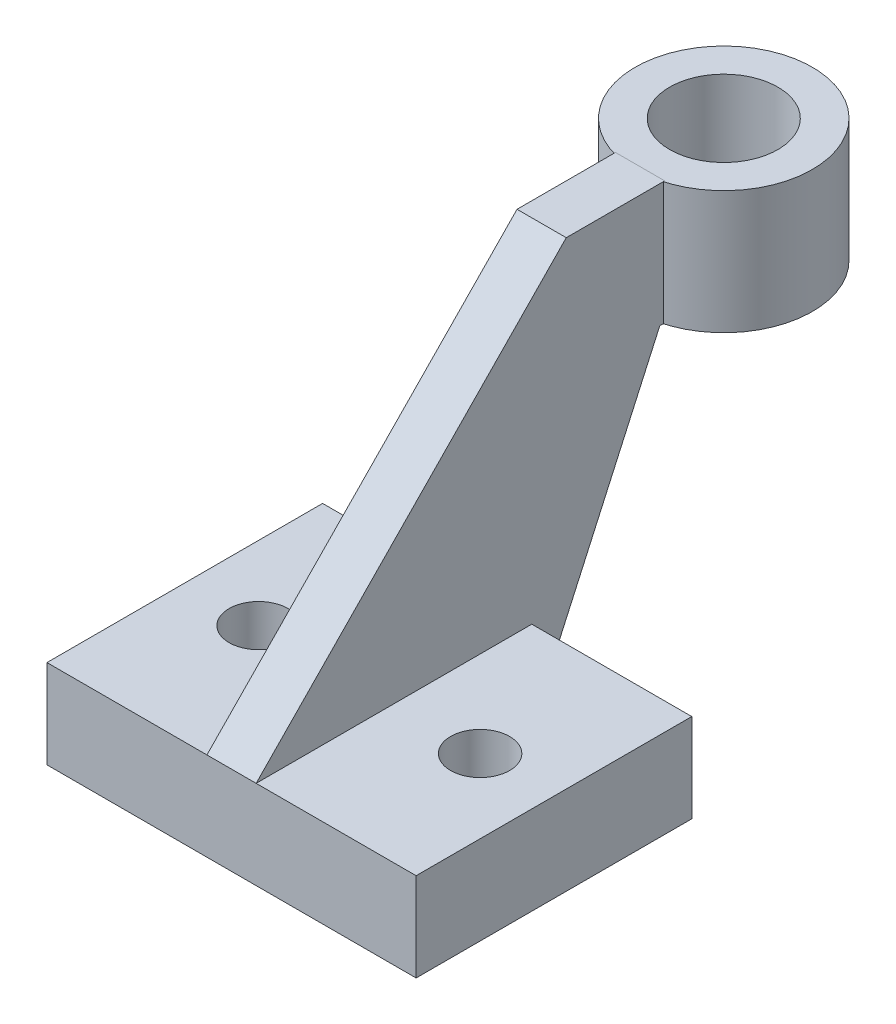
ISO-10303-21;
HEADER;
FILE_DESCRIPTION(('STEP AP214'),'2;1');
FILE_NAME('part.step','',(''),(''),'','','');
FILE_SCHEMA(('AUTOMOTIVE_DESIGN { 1 0 10303 214 1 1 1 1 }'));
ENDSEC;
DATA;
#1=APPLICATION_CONTEXT('core data for automotive mechanical design processes');
#2=APPLICATION_PROTOCOL_DEFINITION('international standard','automotive_design',2000,#1);
#3=PRODUCT_CONTEXT('',#1,'mechanical');
#4=PRODUCT('Part','Part','',(#3));
#5=PRODUCT_RELATED_PRODUCT_CATEGORY('part','',(#4));
#6=PRODUCT_DEFINITION_FORMATION('','',#4);
#7=PRODUCT_DEFINITION_CONTEXT('part definition',#1,'design');
#8=PRODUCT_DEFINITION('design','',#6,#7);
#9=PRODUCT_DEFINITION_SHAPE('','',#8);
#10=(LENGTH_UNIT() NAMED_UNIT(*) SI_UNIT(.MILLI.,.METRE.));
#11=(NAMED_UNIT(*) PLANE_ANGLE_UNIT() SI_UNIT($,.RADIAN.));
#12=(NAMED_UNIT(*) SI_UNIT($,.STERADIAN.) SOLID_ANGLE_UNIT());
#13=UNCERTAINTY_MEASURE_WITH_UNIT(LENGTH_MEASURE(1.E-05),#10,'distance_accuracy_value','');
#14=(GEOMETRIC_REPRESENTATION_CONTEXT(3) GLOBAL_UNCERTAINTY_ASSIGNED_CONTEXT((#13)) GLOBAL_UNIT_ASSIGNED_CONTEXT((#10,
#11,#12)) REPRESENTATION_CONTEXT('',''));
#15=CARTESIAN_POINT('',(0.,0.,0.));
#16=DIRECTION('',(0.,0.,1.));
#17=DIRECTION('',(1.,0.,0.));
#18=AXIS2_PLACEMENT_3D('',#15,#16,#17);
#19=CARTESIAN_POINT('',(0.,82.5,-72.));
#20=DIRECTION('',(0.,1.,0.));
#21=DIRECTION('',(0.,0.,1.));
#22=AXIS2_PLACEMENT_3D('',#19,#20,#21);
#23=PLANE('',#22);
#24=CARTESIAN_POINT('',(0.,82.5,-72.));
#25=DIRECTION('',(0.,1.,0.));
#26=DIRECTION('',(0.,0.,1.));
#27=AXIS2_PLACEMENT_3D('',#24,#25,#26);
#28=CIRCLE('',#27,18.);
#29=CARTESIAN_POINT('',(0.,82.5,-54.));
#30=VERTEX_POINT('',#29);
#31=EDGE_CURVE('E11',#30,#30,#28,.T.);
#32=ORIENTED_EDGE('',*,*,#31,.T.);
#33=EDGE_LOOP('',(#32));
#34=FACE_BOUND('',#33,.T.);
#35=CARTESIAN_POINT('',(0.,82.5,-72.));
#36=DIRECTION('',(0.,1.,0.));
#37=DIRECTION('',(0.,0.,1.));
#38=AXIS2_PLACEMENT_3D('',#35,#36,#37);
#39=CIRCLE('',#38,11.);
#40=CARTESIAN_POINT('',(0.,82.5,-61.));
#41=VERTEX_POINT('',#40);
#42=EDGE_CURVE('E64',#41,#41,#39,.T.);
#43=ORIENTED_EDGE('',*,*,#42,.F.);
#44=EDGE_LOOP('',(#43));
#45=FACE_BOUND('',#44,.T.);
#46=ADVANCED_FACE('F53',(#34,#45),#23,.T.);
#47=CARTESIAN_POINT('',(0.,57.5,-72.));
#48=DIRECTION('',(0.,1.,0.));
#49=DIRECTION('',(0.,0.,1.));
#50=AXIS2_PLACEMENT_3D('',#47,#48,#49);
#51=PLANE('',#50);
#52=CARTESIAN_POINT('',(0.,57.5,-72.));
#53=DIRECTION('',(0.,1.,0.));
#54=DIRECTION('',(0.,0.,1.));
#55=AXIS2_PLACEMENT_3D('',#52,#53,#54);
#56=CIRCLE('',#55,18.);
#57=CARTESIAN_POINT('',(0.,57.5,-54.));
#58=VERTEX_POINT('',#57);
#59=EDGE_CURVE('E57',#58,#58,#56,.T.);
#60=ORIENTED_EDGE('',*,*,#59,.F.);
#61=EDGE_LOOP('',(#60));
#62=FACE_BOUND('',#61,.T.);
#63=CARTESIAN_POINT('',(0.,57.5,-72.));
#64=DIRECTION('',(0.,1.,0.));
#65=DIRECTION('',(0.,0.,1.));
#66=AXIS2_PLACEMENT_3D('',#63,#64,#65);
#67=CIRCLE('',#66,11.);
#68=CARTESIAN_POINT('',(0.,57.5,-61.));
#69=VERTEX_POINT('',#68);
#70=EDGE_CURVE('E66',#69,#69,#67,.T.);
#71=ORIENTED_EDGE('',*,*,#70,.T.);
#72=EDGE_LOOP('',(#71));
#73=FACE_BOUND('',#72,.T.);
#74=ADVANCED_FACE('F76',(#62,#73),#51,.F.);
#75=CARTESIAN_POINT('',(0.,82.5,-72.));
#76=DIRECTION('',(0.,-1.,0.));
#77=DIRECTION('',(0.,0.,-1.));
#78=AXIS2_PLACEMENT_3D('',#75,#76,#77);
#79=CYLINDRICAL_SURFACE('',#78,18.);
#80=ORIENTED_EDGE('',*,*,#31,.F.);
#81=EDGE_LOOP('',(#80));
#82=FACE_BOUND('',#81,.T.);
#83=ORIENTED_EDGE('',*,*,#59,.T.);
#84=EDGE_LOOP('',(#83));
#85=FACE_BOUND('',#84,.T.);
#86=ADVANCED_FACE('F55',(#82,#85),#79,.T.);
#87=CARTESIAN_POINT('',(0.,82.5,-72.));
#88=DIRECTION('',(0.,-1.,0.));
#89=DIRECTION('',(0.,0.,-1.));
#90=AXIS2_PLACEMENT_3D('',#87,#88,#89);
#91=CYLINDRICAL_SURFACE('',#90,11.);
#92=ORIENTED_EDGE('',*,*,#42,.T.);
#93=EDGE_LOOP('',(#92));
#94=FACE_BOUND('',#93,.T.);
#95=ORIENTED_EDGE('',*,*,#70,.F.);
#96=EDGE_LOOP('',(#95));
#97=FACE_BOUND('',#96,.T.);
#98=ADVANCED_FACE('F72',(#94,#97),#91,.F.);
#99=CLOSED_SHELL('',(#46,#74,#86,#98));
#100=MANIFOLD_SOLID_BREP('B2',#99);
#101=CARTESIAN_POINT('',(37.5,18.,28.));
#102=DIRECTION('',(0.,-1.,0.));
#103=DIRECTION('',(0.,0.,-1.));
#104=AXIS2_PLACEMENT_3D('',#101,#102,#103);
#105=PLANE('',#104);
#106=DIRECTION('',(-1.,0.,0.));
#107=VECTOR('',#106,1.);
#108=CARTESIAN_POINT('',(37.5,18.,-28.));
#109=LINE('',#108,#107);
#110=CARTESIAN_POINT('',(37.5,18.,-28.));
#111=VERTEX_POINT('',#110);
#112=CARTESIAN_POINT('',(5.,18.,-28.));
#113=VERTEX_POINT('',#112);
#114=EDGE_CURVE('E311',#111,#113,#109,.T.);
#115=ORIENTED_EDGE('',*,*,#114,.T.);
#116=DIRECTION('',(0.,0.,-1.));
#117=VECTOR('',#116,1.);
#118=CARTESIAN_POINT('',(5.,18.,-28.));
#119=LINE('',#118,#117);
#120=CARTESIAN_POINT('',(5.,18.,28.));
#121=VERTEX_POINT('',#120);
#122=EDGE_CURVE('E261',#121,#113,#119,.T.);
#123=ORIENTED_EDGE('',*,*,#122,.F.);
#124=DIRECTION('',(-1.,0.,0.));
#125=VECTOR('',#124,1.);
#126=CARTESIAN_POINT('',(37.5,18.,28.));
#127=LINE('',#126,#125);
#128=CARTESIAN_POINT('',(37.5,18.,28.));
#129=VERTEX_POINT('',#128);
#130=EDGE_CURVE('E306',#129,#121,#127,.T.);
#131=ORIENTED_EDGE('',*,*,#130,.F.);
#132=DIRECTION('',(0.,0.,1.));
#133=VECTOR('',#132,1.);
#134=CARTESIAN_POINT('',(37.5,18.,28.));
#135=LINE('',#134,#133);
#136=EDGE_CURVE('E288',#111,#129,#135,.T.);
#137=ORIENTED_EDGE('',*,*,#136,.F.);
#138=EDGE_LOOP('',(#115,#123,#131,#137));
#139=FACE_BOUND('',#138,.T.);
#140=CARTESIAN_POINT('',(22.5,18.,0.));
#141=DIRECTION('',(0.,1.,0.));
#142=DIRECTION('',(0.,0.,1.));
#143=AXIS2_PLACEMENT_3D('',#140,#141,#142);
#144=CIRCLE('',#143,6.00000000000001);
#145=CARTESIAN_POINT('',(22.5,18.,6.00000000000001));
#146=VERTEX_POINT('',#145);
#147=EDGE_CURVE('E478',#146,#146,#144,.T.);
#148=ORIENTED_EDGE('',*,*,#147,.F.);
#149=EDGE_LOOP('',(#148));
#150=FACE_BOUND('',#149,.T.);
#151=ADVANCED_FACE('F115',(#139,#150),#105,.F.);
#152=DIRECTION('',(0.,0.,-1.));
#153=VECTOR('',#152,1.);
#154=CARTESIAN_POINT('',(-5.,18.,-28.));
#155=LINE('',#154,#153);
#156=CARTESIAN_POINT('',(-5.,18.,28.));
#157=VERTEX_POINT('',#156);
#158=CARTESIAN_POINT('',(-5.,18.,-28.));
#159=VERTEX_POINT('',#158);
#160=EDGE_CURVE('E240',#157,#159,#155,.T.);
#161=ORIENTED_EDGE('',*,*,#160,.T.);
#162=CARTESIAN_POINT('',(-37.5,18.,-28.));
#163=VERTEX_POINT('',#162);
#164=EDGE_CURVE('E310',#159,#163,#109,.T.);
#165=ORIENTED_EDGE('',*,*,#164,.T.);
#166=DIRECTION('',(0.,0.,1.));
#167=VECTOR('',#166,1.);
#168=CARTESIAN_POINT('',(-37.5,18.,28.));
#169=LINE('',#168,#167);
#170=CARTESIAN_POINT('',(-37.5,18.,28.));
#171=VERTEX_POINT('',#170);
#172=EDGE_CURVE('E282',#163,#171,#169,.T.);
#173=ORIENTED_EDGE('',*,*,#172,.T.);
#174=EDGE_CURVE('E291',#157,#171,#127,.T.);
#175=ORIENTED_EDGE('',*,*,#174,.F.);
#176=EDGE_LOOP('',(#161,#165,#173,#175));
#177=FACE_BOUND('',#176,.T.);
#178=CARTESIAN_POINT('',(-22.5,18.,0.));
#179=DIRECTION('',(0.,1.,0.));
#180=DIRECTION('',(0.,0.,1.));
#181=AXIS2_PLACEMENT_3D('',#178,#179,#180);
#182=CIRCLE('',#181,6.00000000000001);
#183=CARTESIAN_POINT('',(-22.5,18.,6.00000000000001));
#184=VERTEX_POINT('',#183);
#185=EDGE_CURVE('E389',#184,#184,#182,.T.);
#186=ORIENTED_EDGE('',*,*,#185,.F.);
#187=EDGE_LOOP('',(#186));
#188=FACE_BOUND('',#187,.T.);
#189=ADVANCED_FACE('F329',(#177,#188),#105,.F.);
#190=CARTESIAN_POINT('',(37.5,18.,-28.));
#191=DIRECTION('',(0.,0.,1.));
#192=DIRECTION('',(0.,-1.,0.));
#193=AXIS2_PLACEMENT_3D('',#190,#191,#192);
#194=PLANE('',#193);
#195=DIRECTION('',(0.,-1.,0.));
#196=VECTOR('',#195,1.);
#197=CARTESIAN_POINT('',(-5.,0.,-28.));
#198=LINE('',#197,#196);
#199=CARTESIAN_POINT('',(-5.,0.,-28.));
#200=VERTEX_POINT('',#199);
#201=EDGE_CURVE('E131',#159,#200,#198,.T.);
#202=ORIENTED_EDGE('',*,*,#201,.T.);
#203=DIRECTION('',(-1.,0.,0.));
#204=VECTOR('',#203,1.);
#205=CARTESIAN_POINT('',(37.5,0.,-28.));
#206=LINE('',#205,#204);
#207=CARTESIAN_POINT('',(-37.5,0.,-28.));
#208=VERTEX_POINT('',#207);
#209=EDGE_CURVE('E314',#200,#208,#206,.T.);
#210=ORIENTED_EDGE('',*,*,#209,.T.);
#211=DIRECTION('',(0.,1.,0.));
#212=VECTOR('',#211,1.);
#213=CARTESIAN_POINT('',(-37.5,18.,-28.));
#214=LINE('',#213,#212);
#215=EDGE_CURVE('E299',#208,#163,#214,.T.);
#216=ORIENTED_EDGE('',*,*,#215,.T.);
#217=ORIENTED_EDGE('',*,*,#164,.F.);
#218=EDGE_LOOP('',(#202,#210,#216,#217));
#219=FACE_BOUND('',#218,.T.);
#220=ADVANCED_FACE('F319',(#219),#194,.F.);
#221=CARTESIAN_POINT('',(37.5,18.,28.));
#222=DIRECTION('',(0.,0.,-1.));
#223=DIRECTION('',(0.,1.,0.));
#224=AXIS2_PLACEMENT_3D('',#221,#222,#223);
#225=PLANE('',#224);
#226=DIRECTION('',(0.,-1.,0.));
#227=VECTOR('',#226,1.);
#228=CARTESIAN_POINT('',(-37.5,18.,28.));
#229=LINE('',#228,#227);
#230=CARTESIAN_POINT('',(-37.5,0.,28.));
#231=VERTEX_POINT('',#230);
#232=EDGE_CURVE('E276',#171,#231,#229,.T.);
#233=ORIENTED_EDGE('',*,*,#232,.T.);
#234=DIRECTION('',(-1.,0.,0.));
#235=VECTOR('',#234,1.);
#236=CARTESIAN_POINT('',(37.5,0.,28.));
#237=LINE('',#236,#235);
#238=CARTESIAN_POINT('',(37.5,0.,28.));
#239=VERTEX_POINT('',#238);
#240=EDGE_CURVE('E51',#239,#231,#237,.T.);
#241=ORIENTED_EDGE('',*,*,#240,.F.);
#242=DIRECTION('',(0.,-1.,0.));
#243=VECTOR('',#242,1.);
#244=CARTESIAN_POINT('',(37.5,18.,28.));
#245=LINE('',#244,#243);
#246=EDGE_CURVE('E277',#129,#239,#245,.T.);
#247=ORIENTED_EDGE('',*,*,#246,.F.);
#248=ORIENTED_EDGE('',*,*,#130,.T.);
#249=DIRECTION('',(-1.,0.,0.));
#250=VECTOR('',#249,1.);
#251=CARTESIAN_POINT('',(5.,18.,28.));
#252=LINE('',#251,#250);
#253=EDGE_CURVE('E239',#121,#157,#252,.T.);
#254=ORIENTED_EDGE('',*,*,#253,.T.);
#255=ORIENTED_EDGE('',*,*,#174,.T.);
#256=EDGE_LOOP('',(#233,#241,#247,#248,#254,#255));
#257=FACE_BOUND('',#256,.T.);
#258=ADVANCED_FACE('F117',(#257),#225,.F.);
#259=CARTESIAN_POINT('',(37.5,0.,28.));
#260=DIRECTION('',(0.,1.,0.));
#261=DIRECTION('',(0.,0.,1.));
#262=AXIS2_PLACEMENT_3D('',#259,#260,#261);
#263=PLANE('',#262);
#264=CARTESIAN_POINT('',(22.5,0.,0.));
#265=DIRECTION('',(0.,1.,0.));
#266=DIRECTION('',(0.,0.,1.));
#267=AXIS2_PLACEMENT_3D('',#264,#265,#266);
#268=CIRCLE('',#267,6.00000000000001);
#269=CARTESIAN_POINT('',(22.5,0.,6.00000000000001));
#270=VERTEX_POINT('',#269);
#271=EDGE_CURVE('E384',#270,#270,#268,.T.);
#272=ORIENTED_EDGE('',*,*,#271,.T.);
#273=EDGE_LOOP('',(#272));
#274=FACE_BOUND('',#273,.T.);
#275=CARTESIAN_POINT('',(-22.5,0.,0.));
#276=DIRECTION('',(0.,1.,0.));
#277=DIRECTION('',(0.,0.,1.));
#278=AXIS2_PLACEMENT_3D('',#275,#276,#277);
#279=CIRCLE('',#278,6.00000000000001);
#280=CARTESIAN_POINT('',(-22.5,0.,6.00000000000001));
#281=VERTEX_POINT('',#280);
#282=EDGE_CURVE('E243',#281,#281,#279,.T.);
#283=ORIENTED_EDGE('',*,*,#282,.T.);
#284=EDGE_LOOP('',(#283));
#285=FACE_BOUND('',#284,.T.);
#286=DIRECTION('',(0.,0.,-1.));
#287=VECTOR('',#286,1.);
#288=CARTESIAN_POINT('',(-37.5,0.,28.));
#289=LINE('',#288,#287);
#290=EDGE_CURVE('E295',#231,#208,#289,.T.);
#291=ORIENTED_EDGE('',*,*,#290,.T.);
#292=ORIENTED_EDGE('',*,*,#209,.F.);
#293=DIRECTION('',(-1.,0.,0.));
#294=VECTOR('',#293,1.);
#295=CARTESIAN_POINT('',(5.,0.,-28.));
#296=LINE('',#295,#294);
#297=CARTESIAN_POINT('',(5.,0.,-28.));
#298=VERTEX_POINT('',#297);
#299=EDGE_CURVE('E138',#298,#200,#296,.T.);
#300=ORIENTED_EDGE('',*,*,#299,.F.);
#301=CARTESIAN_POINT('',(37.5,0.,-28.));
#302=VERTEX_POINT('',#301);
#303=EDGE_CURVE('E124',#302,#298,#206,.T.);
#304=ORIENTED_EDGE('',*,*,#303,.F.);
#305=DIRECTION('',(0.,0.,-1.));
#306=VECTOR('',#305,1.);
#307=CARTESIAN_POINT('',(37.5,0.,28.));
#308=LINE('',#307,#306);
#309=EDGE_CURVE('E281',#239,#302,#308,.T.);
#310=ORIENTED_EDGE('',*,*,#309,.F.);
#311=ORIENTED_EDGE('',*,*,#240,.T.);
#312=EDGE_LOOP('',(#291,#292,#300,#304,#310,#311));
#313=FACE_BOUND('',#312,.T.);
#314=ADVANCED_FACE('F322',(#274,#285,#313),#263,.F.);
#315=ORIENTED_EDGE('',*,*,#303,.T.);
#316=DIRECTION('',(0.,-1.,0.));
#317=VECTOR('',#316,1.);
#318=CARTESIAN_POINT('',(5.,0.,-28.));
#319=LINE('',#318,#317);
#320=EDGE_CURVE('E208',#113,#298,#319,.T.);
#321=ORIENTED_EDGE('',*,*,#320,.F.);
#322=ORIENTED_EDGE('',*,*,#114,.F.);
#323=DIRECTION('',(0.,1.,0.));
#324=VECTOR('',#323,1.);
#325=CARTESIAN_POINT('',(37.5,18.,-28.));
#326=LINE('',#325,#324);
#327=EDGE_CURVE('E285',#302,#111,#326,.T.);
#328=ORIENTED_EDGE('',*,*,#327,.F.);
#329=EDGE_LOOP('',(#315,#321,#322,#328));
#330=FACE_BOUND('',#329,.T.);
#331=ADVANCED_FACE('F373',(#330),#194,.F.);
#332=CARTESIAN_POINT('',(37.5,0.,0.));
#333=DIRECTION('',(1.,0.,0.));
#334=DIRECTION('',(0.,0.,-1.));
#335=AXIS2_PLACEMENT_3D('',#332,#333,#334);
#336=PLANE('',#335);
#337=ORIENTED_EDGE('',*,*,#246,.T.);
#338=ORIENTED_EDGE('',*,*,#309,.T.);
#339=ORIENTED_EDGE('',*,*,#327,.T.);
#340=ORIENTED_EDGE('',*,*,#136,.T.);
#341=EDGE_LOOP('',(#337,#338,#339,#340));
#342=FACE_BOUND('',#341,.T.);
#343=ADVANCED_FACE('F375',(#342),#336,.T.);
#344=CARTESIAN_POINT('',(-37.5,0.,0.));
#345=DIRECTION('',(1.,0.,0.));
#346=DIRECTION('',(0.,0.,-1.));
#347=AXIS2_PLACEMENT_3D('',#344,#345,#346);
#348=PLANE('',#347);
#349=ORIENTED_EDGE('',*,*,#232,.F.);
#350=ORIENTED_EDGE('',*,*,#172,.F.);
#351=ORIENTED_EDGE('',*,*,#215,.F.);
#352=ORIENTED_EDGE('',*,*,#290,.F.);
#353=EDGE_LOOP('',(#349,#350,#351,#352));
#354=FACE_BOUND('',#353,.T.);
#355=ADVANCED_FACE('F326',(#354),#348,.F.);
#356=CARTESIAN_POINT('',(5.,57.5,-54.));
#357=DIRECTION('',(0.,0.412011262201414,0.911178752945435));
#358=DIRECTION('',(0.,-0.911178752945435,0.412011262201414));
#359=AXIS2_PLACEMENT_3D('',#356,#357,#358);
#360=PLANE('',#359);
#361=DIRECTION('',(0.,0.911178752945435,-0.412011262201414));
#362=VECTOR('',#361,1.);
#363=CARTESIAN_POINT('',(-5.,57.5,-54.));
#364=LINE('',#363,#362);
#365=CARTESIAN_POINT('',(-5.,57.5,-54.));
#366=VERTEX_POINT('',#365);
#367=EDGE_CURVE('E216',#200,#366,#364,.T.);
#368=ORIENTED_EDGE('',*,*,#367,.T.);
#369=DIRECTION('',(-1.,0.,0.));
#370=VECTOR('',#369,1.);
#371=CARTESIAN_POINT('',(5.,57.5,-54.));
#372=LINE('',#371,#370);
#373=CARTESIAN_POINT('',(5.,57.5,-54.));
#374=VERTEX_POINT('',#373);
#375=EDGE_CURVE('E213',#374,#366,#372,.T.);
#376=ORIENTED_EDGE('',*,*,#375,.F.);
#377=DIRECTION('',(0.,0.911178752945435,-0.412011262201414));
#378=VECTOR('',#377,1.);
#379=CARTESIAN_POINT('',(5.,57.5,-54.));
#380=LINE('',#379,#378);
#381=EDGE_CURVE('E201',#298,#374,#380,.T.);
#382=ORIENTED_EDGE('',*,*,#381,.F.);
#383=ORIENTED_EDGE('',*,*,#299,.T.);
#384=EDGE_LOOP('',(#368,#376,#382,#383));
#385=FACE_BOUND('',#384,.T.);
#386=ADVANCED_FACE('F214',(#385),#360,.F.);
#387=CARTESIAN_POINT('',(5.,57.5,-55.));
#388=DIRECTION('',(0.,1.,0.));
#389=DIRECTION('',(0.,0.,1.));
#390=AXIS2_PLACEMENT_3D('',#387,#388,#389);
#391=PLANE('',#390);
#392=DIRECTION('',(0.,0.,-1.));
#393=VECTOR('',#392,1.);
#394=CARTESIAN_POINT('',(-5.,57.5,-55.));
#395=LINE('',#394,#393);
#396=CARTESIAN_POINT('',(-5.,57.5,-55.));
#397=VERTEX_POINT('',#396);
#398=EDGE_CURVE('E248',#366,#397,#395,.T.);
#399=ORIENTED_EDGE('',*,*,#398,.T.);
#400=DIRECTION('',(-1.,0.,0.));
#401=VECTOR('',#400,1.);
#402=CARTESIAN_POINT('',(5.,57.5,-55.));
#403=LINE('',#402,#401);
#404=CARTESIAN_POINT('',(5.,57.5,-55.));
#405=VERTEX_POINT('',#404);
#406=EDGE_CURVE('E220',#405,#397,#403,.T.);
#407=ORIENTED_EDGE('',*,*,#406,.F.);
#408=DIRECTION('',(0.,0.,-1.));
#409=VECTOR('',#408,1.);
#410=CARTESIAN_POINT('',(5.,57.5,-55.));
#411=LINE('',#410,#409);
#412=EDGE_CURVE('E206',#374,#405,#411,.T.);
#413=ORIENTED_EDGE('',*,*,#412,.F.);
#414=ORIENTED_EDGE('',*,*,#375,.T.);
#415=EDGE_LOOP('',(#399,#407,#413,#414));
#416=FACE_BOUND('',#415,.T.);
#417=ADVANCED_FACE('F222',(#416),#391,.F.);
#418=CARTESIAN_POINT('',(5.,82.5,-55.));
#419=DIRECTION('',(0.,0.,1.));
#420=DIRECTION('',(1.,0.,0.));
#421=AXIS2_PLACEMENT_3D('',#418,#419,#420);
#422=PLANE('',#421);
#423=DIRECTION('',(0.,1.,0.));
#424=VECTOR('',#423,1.);
#425=CARTESIAN_POINT('',(-5.,82.5,-55.));
#426=LINE('',#425,#424);
#427=CARTESIAN_POINT('',(-5.,82.5,-55.));
#428=VERTEX_POINT('',#427);
#429=EDGE_CURVE('E251',#397,#428,#426,.T.);
#430=ORIENTED_EDGE('',*,*,#429,.T.);
#431=DIRECTION('',(-1.,0.,0.));
#432=VECTOR('',#431,1.);
#433=CARTESIAN_POINT('',(5.,82.5,-55.));
#434=LINE('',#433,#432);
#435=CARTESIAN_POINT('',(5.,82.5,-55.));
#436=VERTEX_POINT('',#435);
#437=EDGE_CURVE('E268',#436,#428,#434,.T.);
#438=ORIENTED_EDGE('',*,*,#437,.F.);
#439=DIRECTION('',(0.,1.,0.));
#440=VECTOR('',#439,1.);
#441=CARTESIAN_POINT('',(5.,82.5,-55.));
#442=LINE('',#441,#440);
#443=EDGE_CURVE('E226',#405,#436,#442,.T.);
#444=ORIENTED_EDGE('',*,*,#443,.F.);
#445=ORIENTED_EDGE('',*,*,#406,.T.);
#446=EDGE_LOOP('',(#430,#438,#444,#445));
#447=FACE_BOUND('',#446,.T.);
#448=ADVANCED_FACE('F348',(#447),#422,.F.);
#449=CARTESIAN_POINT('',(5.,82.5,-35.));
#450=DIRECTION('',(0.,-1.,0.));
#451=DIRECTION('',(0.,0.,-1.));
#452=AXIS2_PLACEMENT_3D('',#449,#450,#451);
#453=PLANE('',#452);
#454=DIRECTION('',(0.,0.,1.));
#455=VECTOR('',#454,1.);
#456=CARTESIAN_POINT('',(-5.,82.5,-35.));
#457=LINE('',#456,#455);
#458=CARTESIAN_POINT('',(-5.,82.5,-35.));
#459=VERTEX_POINT('',#458);
#460=EDGE_CURVE('E254',#428,#459,#457,.T.);
#461=ORIENTED_EDGE('',*,*,#460,.T.);
#462=DIRECTION('',(-1.,0.,0.));
#463=VECTOR('',#462,1.);
#464=CARTESIAN_POINT('',(5.,82.5,-35.));
#465=LINE('',#464,#463);
#466=CARTESIAN_POINT('',(5.,82.5,-35.));
#467=VERTEX_POINT('',#466);
#468=EDGE_CURVE('E264',#467,#459,#465,.T.);
#469=ORIENTED_EDGE('',*,*,#468,.F.);
#470=DIRECTION('',(0.,0.,1.));
#471=VECTOR('',#470,1.);
#472=CARTESIAN_POINT('',(5.,82.5,-35.));
#473=LINE('',#472,#471);
#474=EDGE_CURVE('E229',#436,#467,#473,.T.);
#475=ORIENTED_EDGE('',*,*,#474,.F.);
#476=ORIENTED_EDGE('',*,*,#437,.T.);
#477=EDGE_LOOP('',(#461,#469,#475,#476));
#478=FACE_BOUND('',#477,.T.);
#479=ADVANCED_FACE('F352',(#478),#453,.F.);
#480=CARTESIAN_POINT('',(5.,18.,28.));
#481=DIRECTION('',(0.,-0.698739523875169,-0.71537617920553));
#482=DIRECTION('',(0.,0.71537617920553,-0.698739523875169));
#483=AXIS2_PLACEMENT_3D('',#480,#481,#482);
#484=PLANE('',#483);
#485=DIRECTION('',(0.,-0.71537617920553,0.698739523875169));
#486=VECTOR('',#485,1.);
#487=CARTESIAN_POINT('',(-5.,18.,28.));
#488=LINE('',#487,#486);
#489=EDGE_CURVE('E257',#459,#157,#488,.T.);
#490=ORIENTED_EDGE('',*,*,#489,.T.);
#491=ORIENTED_EDGE('',*,*,#253,.F.);
#492=DIRECTION('',(0.,-0.71537617920553,0.698739523875169));
#493=VECTOR('',#492,1.);
#494=CARTESIAN_POINT('',(5.,18.,28.));
#495=LINE('',#494,#493);
#496=EDGE_CURVE('E235',#467,#121,#495,.T.);
#497=ORIENTED_EDGE('',*,*,#496,.F.);
#498=ORIENTED_EDGE('',*,*,#468,.T.);
#499=EDGE_LOOP('',(#490,#491,#497,#498));
#500=FACE_BOUND('',#499,.T.);
#501=ADVANCED_FACE('F340',(#500),#484,.F.);
#502=CARTESIAN_POINT('',(5.,0.,0.));
#503=DIRECTION('',(1.,0.,0.));
#504=DIRECTION('',(0.,0.,-1.));
#505=AXIS2_PLACEMENT_3D('',#502,#503,#504);
#506=PLANE('',#505);
#507=ORIENTED_EDGE('',*,*,#122,.T.);
#508=ORIENTED_EDGE('',*,*,#320,.T.);
#509=ORIENTED_EDGE('',*,*,#381,.T.);
#510=ORIENTED_EDGE('',*,*,#412,.T.);
#511=ORIENTED_EDGE('',*,*,#443,.T.);
#512=ORIENTED_EDGE('',*,*,#474,.T.);
#513=ORIENTED_EDGE('',*,*,#496,.T.);
#514=EDGE_LOOP('',(#507,#508,#509,#510,#511,#512,#513));
#515=FACE_BOUND('',#514,.T.);
#516=ADVANCED_FACE('F204',(#515),#506,.T.);
#517=CARTESIAN_POINT('',(-5.,0.,0.));
#518=DIRECTION('',(1.,0.,0.));
#519=DIRECTION('',(0.,0.,-1.));
#520=AXIS2_PLACEMENT_3D('',#517,#518,#519);
#521=PLANE('',#520);
#522=ORIENTED_EDGE('',*,*,#160,.F.);
#523=ORIENTED_EDGE('',*,*,#489,.F.);
#524=ORIENTED_EDGE('',*,*,#460,.F.);
#525=ORIENTED_EDGE('',*,*,#429,.F.);
#526=ORIENTED_EDGE('',*,*,#398,.F.);
#527=ORIENTED_EDGE('',*,*,#367,.F.);
#528=ORIENTED_EDGE('',*,*,#201,.F.);
#529=EDGE_LOOP('',(#522,#523,#524,#525,#526,#527,#528));
#530=FACE_BOUND('',#529,.T.);
#531=ADVANCED_FACE('F345',(#530),#521,.F.);
#532=CARTESIAN_POINT('',(-22.5,18.,0.));
#533=DIRECTION('',(0.,1.,0.));
#534=DIRECTION('',(0.,0.,1.));
#535=AXIS2_PLACEMENT_3D('',#532,#533,#534);
#536=CYLINDRICAL_SURFACE('',#535,6.00000000000001);
#537=ORIENTED_EDGE('',*,*,#282,.F.);
#538=EDGE_LOOP('',(#537));
#539=FACE_BOUND('',#538,.T.);
#540=ORIENTED_EDGE('',*,*,#185,.T.);
#541=EDGE_LOOP('',(#540));
#542=FACE_BOUND('',#541,.T.);
#543=ADVANCED_FACE('F446',(#539,#542),#536,.F.);
#544=CARTESIAN_POINT('',(22.5,18.,0.));
#545=DIRECTION('',(0.,1.,0.));
#546=DIRECTION('',(0.,0.,1.));
#547=AXIS2_PLACEMENT_3D('',#544,#545,#546);
#548=CYLINDRICAL_SURFACE('',#547,6.00000000000001);
#549=ORIENTED_EDGE('',*,*,#271,.F.);
#550=EDGE_LOOP('',(#549));
#551=FACE_BOUND('',#550,.T.);
#552=ORIENTED_EDGE('',*,*,#147,.T.);
#553=EDGE_LOOP('',(#552));
#554=FACE_BOUND('',#553,.T.);
#555=ADVANCED_FACE('F460',(#551,#554),#548,.F.);
#556=CLOSED_SHELL('',(#151,#189,#220,#258,#314,#331,#343,#355,#386,#417,#448,#479,#501,#516,
#531,#543,#555));
#557=MANIFOLD_SOLID_BREP('B6',#556);
#558=ADVANCED_BREP_SHAPE_REPRESENTATION('',(#18,#100,#557),#14);
#559=SHAPE_DEFINITION_REPRESENTATION(#9,#558);
ENDSEC;
END-ISO-10303-21;
